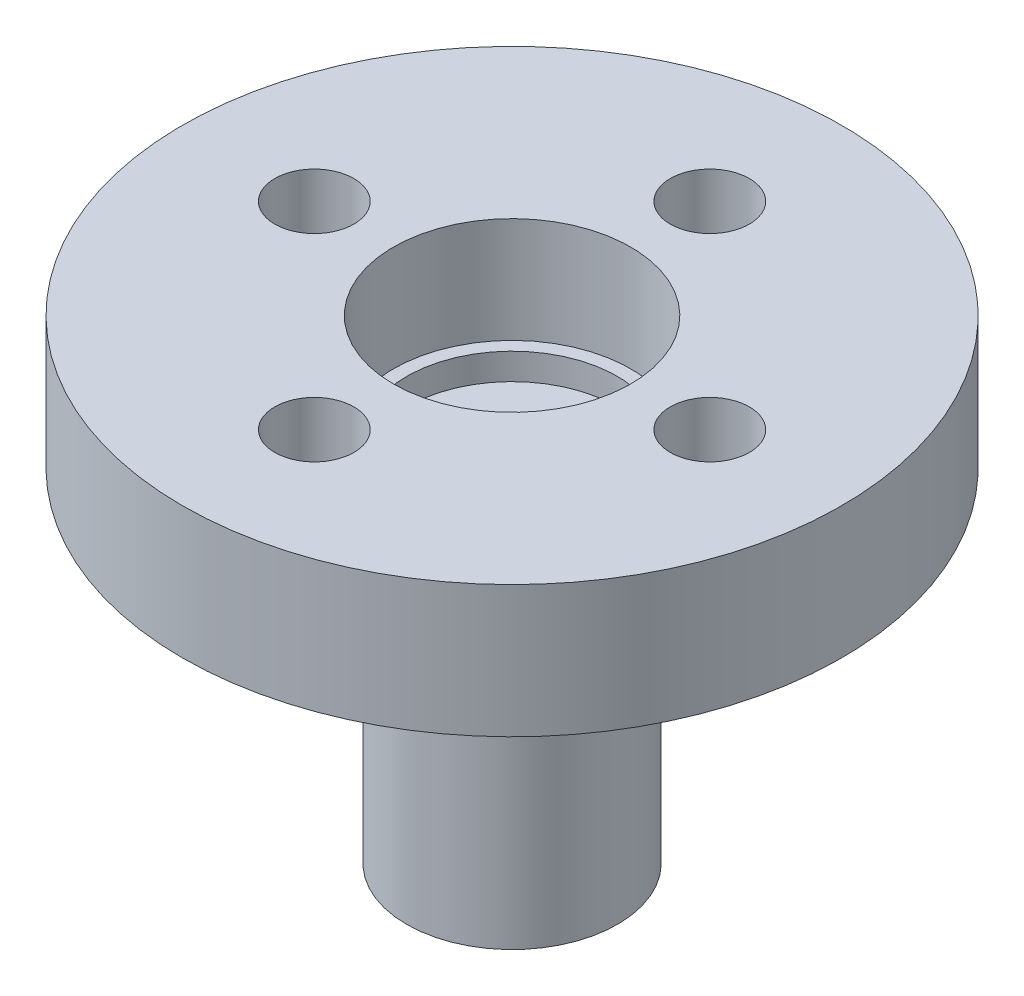
ISO-10303-21;
HEADER;
FILE_DESCRIPTION(('STEP AP214'),'2;1');
FILE_NAME('part.step','',(''),(''),'','','');
FILE_SCHEMA(('AUTOMOTIVE_DESIGN { 1 0 10303 214 1 1 1 1 }'));
ENDSEC;
DATA;
#1=APPLICATION_CONTEXT('core data for automotive mechanical design processes');
#2=APPLICATION_PROTOCOL_DEFINITION('international standard','automotive_design',2000,#1);
#3=PRODUCT_CONTEXT('',#1,'mechanical');
#4=PRODUCT('Part','Part','',(#3));
#5=PRODUCT_RELATED_PRODUCT_CATEGORY('part','',(#4));
#6=PRODUCT_DEFINITION_FORMATION('','',#4);
#7=PRODUCT_DEFINITION_CONTEXT('part definition',#1,'design');
#8=PRODUCT_DEFINITION('design','',#6,#7);
#9=PRODUCT_DEFINITION_SHAPE('','',#8);
#10=(LENGTH_UNIT() NAMED_UNIT(*) SI_UNIT(.MILLI.,.METRE.));
#11=(NAMED_UNIT(*) PLANE_ANGLE_UNIT() SI_UNIT($,.RADIAN.));
#12=(NAMED_UNIT(*) SI_UNIT($,.STERADIAN.) SOLID_ANGLE_UNIT());
#13=UNCERTAINTY_MEASURE_WITH_UNIT(LENGTH_MEASURE(1.E-05),#10,'distance_accuracy_value','');
#14=(GEOMETRIC_REPRESENTATION_CONTEXT(3) GLOBAL_UNCERTAINTY_ASSIGNED_CONTEXT((#13)) GLOBAL_UNIT_ASSIGNED_CONTEXT((#10,
#11,#12)) REPRESENTATION_CONTEXT('',''));
#15=CARTESIAN_POINT('',(0.,0.,0.));
#16=DIRECTION('',(0.,0.,1.));
#17=DIRECTION('',(1.,0.,0.));
#18=AXIS2_PLACEMENT_3D('',#15,#16,#17);
#19=CARTESIAN_POINT('',(-7.49999999999979,5.,2.1270357817835E-13));
#20=DIRECTION('',(0.,-1.,0.));
#21=DIRECTION('',(0.,0.,-1.));
#22=AXIS2_PLACEMENT_3D('',#19,#20,#21);
#23=CYLINDRICAL_SURFACE('',#22,1.50000000000034);
#24=CARTESIAN_POINT('',(-7.49999999999979,5.,2.1270357817835E-13));
#25=DIRECTION('',(0.,1.,0.));
#26=DIRECTION('',(0.,0.,1.));
#27=AXIS2_PLACEMENT_3D('',#24,#25,#26);
#28=CIRCLE('',#27,1.50000000000034);
#29=CARTESIAN_POINT('',(-7.49999999999979,5.,1.50000000000055));
#30=VERTEX_POINT('',#29);
#31=EDGE_CURVE('E46',#30,#30,#28,.T.);
#32=ORIENTED_EDGE('',*,*,#31,.T.);
#33=EDGE_LOOP('',(#32));
#34=FACE_BOUND('',#33,.T.);
#35=CARTESIAN_POINT('',(-7.49999999999979,0.,2.1270357817835E-13));
#36=DIRECTION('',(0.,1.,0.));
#37=DIRECTION('',(0.,0.,1.));
#38=AXIS2_PLACEMENT_3D('',#35,#36,#37);
#39=CIRCLE('',#38,1.50000000000034);
#40=CARTESIAN_POINT('',(-7.49999999999979,0.,1.50000000000055));
#41=VERTEX_POINT('',#40);
#42=EDGE_CURVE('E65',#41,#41,#39,.T.);
#43=ORIENTED_EDGE('',*,*,#42,.F.);
#44=EDGE_LOOP('',(#43));
#45=FACE_BOUND('',#44,.T.);
#46=ADVANCED_FACE('F35',(#34,#45),#23,.F.);
#47=CARTESIAN_POINT('',(4.23570186157979E-13,5.,7.5));
#48=DIRECTION('',(0.,-1.,0.));
#49=DIRECTION('',(0.,0.,-1.));
#50=AXIS2_PLACEMENT_3D('',#47,#48,#49);
#51=CYLINDRICAL_SURFACE('',#50,1.50000000000045);
#52=CARTESIAN_POINT('',(4.23570186157979E-13,5.,7.5));
#53=DIRECTION('',(0.,1.,0.));
#54=DIRECTION('',(0.,0.,1.));
#55=AXIS2_PLACEMENT_3D('',#52,#53,#54);
#56=CIRCLE('',#55,1.50000000000045);
#57=CARTESIAN_POINT('',(4.23570186157979E-13,5.,9.00000000000045));
#58=VERTEX_POINT('',#57);
#59=EDGE_CURVE('E51',#58,#58,#56,.T.);
#60=ORIENTED_EDGE('',*,*,#59,.T.);
#61=EDGE_LOOP('',(#60));
#62=FACE_BOUND('',#61,.T.);
#63=CARTESIAN_POINT('',(4.23570186157979E-13,0.,7.5));
#64=DIRECTION('',(0.,1.,0.));
#65=DIRECTION('',(0.,0.,1.));
#66=AXIS2_PLACEMENT_3D('',#63,#64,#65);
#67=CIRCLE('',#66,1.50000000000045);
#68=CARTESIAN_POINT('',(4.23570186157979E-13,0.,9.00000000000045));
#69=VERTEX_POINT('',#68);
#70=EDGE_CURVE('E62',#69,#69,#67,.T.);
#71=ORIENTED_EDGE('',*,*,#70,.F.);
#72=EDGE_LOOP('',(#71));
#73=FACE_BOUND('',#72,.T.);
#74=ADVANCED_FACE('F87',(#62,#73),#51,.F.);
#75=CARTESIAN_POINT('',(7.50000000000021,5.,-2.11785093078989E-13));
#76=DIRECTION('',(0.,-1.,0.));
#77=DIRECTION('',(0.,0.,-1.));
#78=AXIS2_PLACEMENT_3D('',#75,#76,#77);
#79=CYLINDRICAL_SURFACE('',#78,1.50000000000017);
#80=CARTESIAN_POINT('',(7.50000000000021,5.,-2.11785093078989E-13));
#81=DIRECTION('',(0.,1.,0.));
#82=DIRECTION('',(0.,0.,1.));
#83=AXIS2_PLACEMENT_3D('',#80,#81,#82);
#84=CIRCLE('',#83,1.50000000000017);
#85=CARTESIAN_POINT('',(7.50000000000021,5.,1.49999999999995));
#86=VERTEX_POINT('',#85);
#87=EDGE_CURVE('E78',#86,#86,#84,.T.);
#88=ORIENTED_EDGE('',*,*,#87,.T.);
#89=EDGE_LOOP('',(#88));
#90=FACE_BOUND('',#89,.T.);
#91=CARTESIAN_POINT('',(7.50000000000021,0.,-2.11785093078989E-13));
#92=DIRECTION('',(0.,1.,0.));
#93=DIRECTION('',(0.,0.,1.));
#94=AXIS2_PLACEMENT_3D('',#91,#92,#93);
#95=CIRCLE('',#94,1.50000000000017);
#96=CARTESIAN_POINT('',(7.50000000000021,0.,1.49999999999995));
#97=VERTEX_POINT('',#96);
#98=EDGE_CURVE('E58',#97,#97,#95,.T.);
#99=ORIENTED_EDGE('',*,*,#98,.F.);
#100=EDGE_LOOP('',(#99));
#101=FACE_BOUND('',#100,.T.);
#102=ADVANCED_FACE('F124',(#90,#101),#79,.F.);
#103=CARTESIAN_POINT('',(0.,5.,-7.5));
#104=DIRECTION('',(0.,-1.,0.));
#105=DIRECTION('',(0.,0.,-1.));
#106=AXIS2_PLACEMENT_3D('',#103,#104,#105);
#107=CYLINDRICAL_SURFACE('',#106,1.5);
#108=CARTESIAN_POINT('',(0.,5.,-7.5));
#109=DIRECTION('',(0.,1.,0.));
#110=DIRECTION('',(0.,0.,1.));
#111=AXIS2_PLACEMENT_3D('',#108,#109,#110);
#112=CIRCLE('',#111,1.5);
#113=CARTESIAN_POINT('',(0.,5.,-6.));
#114=VERTEX_POINT('',#113);
#115=EDGE_CURVE('E73',#114,#114,#112,.T.);
#116=ORIENTED_EDGE('',*,*,#115,.T.);
#117=EDGE_LOOP('',(#116));
#118=FACE_BOUND('',#117,.T.);
#119=CARTESIAN_POINT('',(0.,0.,-7.5));
#120=DIRECTION('',(0.,1.,0.));
#121=DIRECTION('',(0.,0.,1.));
#122=AXIS2_PLACEMENT_3D('',#119,#120,#121);
#123=CIRCLE('',#122,1.5);
#124=CARTESIAN_POINT('',(0.,0.,-6.));
#125=VERTEX_POINT('',#124);
#126=EDGE_CURVE('E55',#125,#125,#123,.T.);
#127=ORIENTED_EDGE('',*,*,#126,.F.);
#128=EDGE_LOOP('',(#127));
#129=FACE_BOUND('',#128,.T.);
#130=ADVANCED_FACE('F126',(#118,#129),#107,.F.);
#131=CARTESIAN_POINT('',(0.,5.,0.));
#132=DIRECTION('',(0.,-1.,0.));
#133=DIRECTION('',(0.,0.,-1.));
#134=AXIS2_PLACEMENT_3D('',#131,#132,#133);
#135=CYLINDRICAL_SURFACE('',#134,4.5);
#136=CARTESIAN_POINT('',(0.,1.,0.));
#137=DIRECTION('',(0.,1.,0.));
#138=DIRECTION('',(0.,0.,1.));
#139=AXIS2_PLACEMENT_3D('',#136,#137,#138);
#140=CIRCLE('',#139,4.5);
#141=CARTESIAN_POINT('',(0.,1.,4.5));
#142=VERTEX_POINT('',#141);
#143=EDGE_CURVE('E10',#142,#142,#140,.T.);
#144=ORIENTED_EDGE('',*,*,#143,.F.);
#145=EDGE_LOOP('',(#144));
#146=FACE_BOUND('',#145,.T.);
#147=CARTESIAN_POINT('',(0.,5.,0.));
#148=DIRECTION('',(0.,1.,0.));
#149=DIRECTION('',(0.,0.,1.));
#150=AXIS2_PLACEMENT_3D('',#147,#148,#149);
#151=CIRCLE('',#150,4.5);
#152=CARTESIAN_POINT('',(0.,5.,4.5));
#153=VERTEX_POINT('',#152);
#154=EDGE_CURVE('E69',#153,#153,#151,.T.);
#155=ORIENTED_EDGE('',*,*,#154,.T.);
#156=EDGE_LOOP('',(#155));
#157=FACE_BOUND('',#156,.T.);
#158=ADVANCED_FACE('F37',(#146,#157),#135,.F.);
#159=CARTESIAN_POINT('',(0.,5.,0.));
#160=DIRECTION('',(0.,-1.,0.));
#161=DIRECTION('',(0.,0.,-1.));
#162=AXIS2_PLACEMENT_3D('',#159,#160,#161);
#163=CYLINDRICAL_SURFACE('',#162,12.5);
#164=CARTESIAN_POINT('',(0.,5.,0.));
#165=DIRECTION('',(0.,1.,0.));
#166=DIRECTION('',(0.,0.,1.));
#167=AXIS2_PLACEMENT_3D('',#164,#165,#166);
#168=CIRCLE('',#167,12.5);
#169=CARTESIAN_POINT('',(0.,5.,12.5));
#170=VERTEX_POINT('',#169);
#171=EDGE_CURVE('E42',#170,#170,#168,.T.);
#172=ORIENTED_EDGE('',*,*,#171,.F.);
#173=EDGE_LOOP('',(#172));
#174=FACE_BOUND('',#173,.T.);
#175=CARTESIAN_POINT('',(0.,0.,0.));
#176=DIRECTION('',(0.,1.,0.));
#177=DIRECTION('',(0.,0.,1.));
#178=AXIS2_PLACEMENT_3D('',#175,#176,#177);
#179=CIRCLE('',#178,12.5);
#180=CARTESIAN_POINT('',(0.,0.,12.5));
#181=VERTEX_POINT('',#180);
#182=EDGE_CURVE('E67',#181,#181,#179,.T.);
#183=ORIENTED_EDGE('',*,*,#182,.T.);
#184=EDGE_LOOP('',(#183));
#185=FACE_BOUND('',#184,.T.);
#186=ADVANCED_FACE('F94',(#174,#185),#163,.T.);
#187=CARTESIAN_POINT('',(0.,5.,0.));
#188=DIRECTION('',(0.,1.,0.));
#189=DIRECTION('',(0.,0.,1.));
#190=AXIS2_PLACEMENT_3D('',#187,#188,#189);
#191=PLANE('',#190);
#192=ORIENTED_EDGE('',*,*,#154,.F.);
#193=EDGE_LOOP('',(#192));
#194=FACE_BOUND('',#193,.T.);
#195=ORIENTED_EDGE('',*,*,#115,.F.);
#196=EDGE_LOOP('',(#195));
#197=FACE_BOUND('',#196,.T.);
#198=ORIENTED_EDGE('',*,*,#87,.F.);
#199=EDGE_LOOP('',(#198));
#200=FACE_BOUND('',#199,.T.);
#201=ORIENTED_EDGE('',*,*,#59,.F.);
#202=EDGE_LOOP('',(#201));
#203=FACE_BOUND('',#202,.T.);
#204=ORIENTED_EDGE('',*,*,#31,.F.);
#205=EDGE_LOOP('',(#204));
#206=FACE_BOUND('',#205,.T.);
#207=ORIENTED_EDGE('',*,*,#171,.T.);
#208=EDGE_LOOP('',(#207));
#209=FACE_BOUND('',#208,.T.);
#210=ADVANCED_FACE('F90',(#194,#197,#200,#203,#206,#209),#191,.T.);
#211=CARTESIAN_POINT('',(0.,0.,0.));
#212=DIRECTION('',(0.,1.,0.));
#213=DIRECTION('',(0.,0.,1.));
#214=AXIS2_PLACEMENT_3D('',#211,#212,#213);
#215=PLANE('',#214);
#216=CARTESIAN_POINT('',(0.,0.,0.));
#217=DIRECTION('',(0.,1.,0.));
#218=DIRECTION('',(0.,0.,1.));
#219=AXIS2_PLACEMENT_3D('',#216,#217,#218);
#220=CIRCLE('',#219,4.5);
#221=CARTESIAN_POINT('',(0.,0.,4.5));
#222=VERTEX_POINT('',#221);
#223=EDGE_CURVE('E59',#222,#222,#220,.T.);
#224=ORIENTED_EDGE('',*,*,#223,.T.);
#225=EDGE_LOOP('',(#224));
#226=FACE_BOUND('',#225,.T.);
#227=ORIENTED_EDGE('',*,*,#126,.T.);
#228=EDGE_LOOP('',(#227));
#229=FACE_BOUND('',#228,.T.);
#230=ORIENTED_EDGE('',*,*,#98,.T.);
#231=EDGE_LOOP('',(#230));
#232=FACE_BOUND('',#231,.T.);
#233=ORIENTED_EDGE('',*,*,#70,.T.);
#234=EDGE_LOOP('',(#233));
#235=FACE_BOUND('',#234,.T.);
#236=ORIENTED_EDGE('',*,*,#42,.T.);
#237=EDGE_LOOP('',(#236));
#238=FACE_BOUND('',#237,.T.);
#239=ORIENTED_EDGE('',*,*,#182,.F.);
#240=EDGE_LOOP('',(#239));
#241=FACE_BOUND('',#240,.T.);
#242=ADVANCED_FACE('F93',(#226,#229,#232,#235,#238,#241),#215,.F.);
#243=CARTESIAN_POINT('',(0.,-1.,0.));
#244=DIRECTION('',(0.,1.,0.));
#245=DIRECTION('',(0.,0.,1.));
#246=AXIS2_PLACEMENT_3D('',#243,#244,#245);
#247=CYLINDRICAL_SURFACE('',#246,4.5);
#248=CARTESIAN_POINT('',(0.,-1.,0.));
#249=DIRECTION('',(0.,1.,0.));
#250=DIRECTION('',(0.,0.,1.));
#251=AXIS2_PLACEMENT_3D('',#248,#249,#250);
#252=CIRCLE('',#251,4.5);
#253=CARTESIAN_POINT('',(0.,-1.,4.5));
#254=VERTEX_POINT('',#253);
#255=EDGE_CURVE('E231',#254,#254,#252,.T.);
#256=ORIENTED_EDGE('',*,*,#255,.T.);
#257=EDGE_LOOP('',(#256));
#258=FACE_BOUND('',#257,.T.);
#259=ORIENTED_EDGE('',*,*,#223,.F.);
#260=EDGE_LOOP('',(#259));
#261=FACE_BOUND('',#260,.T.);
#262=ADVANCED_FACE('F106',(#258,#261),#247,.T.);
#263=CARTESIAN_POINT('',(0.,-1.,0.));
#264=DIRECTION('',(0.,1.,0.));
#265=DIRECTION('',(0.,0.,1.));
#266=AXIS2_PLACEMENT_3D('',#263,#264,#265);
#267=CYLINDRICAL_SURFACE('',#266,4.);
#268=CARTESIAN_POINT('',(0.,0.,0.));
#269=DIRECTION('',(0.,1.,0.));
#270=DIRECTION('',(0.,0.,1.));
#271=AXIS2_PLACEMENT_3D('',#268,#269,#270);
#272=CIRCLE('',#271,4.);
#273=CARTESIAN_POINT('',(0.,0.,4.));
#274=VERTEX_POINT('',#273);
#275=EDGE_CURVE('E239',#274,#274,#272,.T.);
#276=ORIENTED_EDGE('',*,*,#275,.F.);
#277=EDGE_LOOP('',(#276));
#278=FACE_BOUND('',#277,.T.);
#279=CARTESIAN_POINT('',(0.,1.,0.));
#280=DIRECTION('',(0.,1.,0.));
#281=DIRECTION('',(0.,0.,1.));
#282=AXIS2_PLACEMENT_3D('',#279,#280,#281);
#283=CIRCLE('',#282,4.);
#284=CARTESIAN_POINT('',(0.,1.,4.));
#285=VERTEX_POINT('',#284);
#286=EDGE_CURVE('E229',#285,#285,#283,.T.);
#287=ORIENTED_EDGE('',*,*,#286,.T.);
#288=EDGE_LOOP('',(#287));
#289=FACE_BOUND('',#288,.T.);
#290=ADVANCED_FACE('F112',(#278,#289),#267,.F.);
#291=CARTESIAN_POINT('',(0.,-1.,0.));
#292=DIRECTION('',(0.,1.,0.));
#293=DIRECTION('',(0.,0.,1.));
#294=AXIS2_PLACEMENT_3D('',#291,#292,#293);
#295=PLANE('',#294);
#296=CARTESIAN_POINT('',(0.,-0.999999999999999,0.));
#297=DIRECTION('',(0.,1.,0.));
#298=DIRECTION('',(0.,0.,1.));
#299=AXIS2_PLACEMENT_3D('',#296,#297,#298);
#300=CIRCLE('',#299,4.);
#301=CARTESIAN_POINT('',(0.,-1.,4.));
#302=VERTEX_POINT('',#301);
#303=EDGE_CURVE('E232',#302,#302,#300,.T.);
#304=ORIENTED_EDGE('',*,*,#303,.T.);
#305=EDGE_LOOP('',(#304));
#306=FACE_BOUND('',#305,.T.);
#307=ORIENTED_EDGE('',*,*,#255,.F.);
#308=EDGE_LOOP('',(#307));
#309=FACE_BOUND('',#308,.T.);
#310=ADVANCED_FACE('F203',(#306,#309),#295,.F.);
#311=CARTESIAN_POINT('',(0.,1.,0.));
#312=DIRECTION('',(0.,1.,0.));
#313=DIRECTION('',(0.,0.,1.));
#314=AXIS2_PLACEMENT_3D('',#311,#312,#313);
#315=PLANE('',#314);
#316=ORIENTED_EDGE('',*,*,#286,.F.);
#317=EDGE_LOOP('',(#316));
#318=FACE_BOUND('',#317,.T.);
#319=ORIENTED_EDGE('',*,*,#143,.T.);
#320=EDGE_LOOP('',(#319));
#321=FACE_BOUND('',#320,.T.);
#322=ADVANCED_FACE('F182',(#318,#321),#315,.T.);
#323=CARTESIAN_POINT('',(0.,-13.,0.));
#324=DIRECTION('',(0.,1.,0.));
#325=DIRECTION('',(0.,0.,1.));
#326=AXIS2_PLACEMENT_3D('',#323,#324,#325);
#327=PLANE('',#326);
#328=CARTESIAN_POINT('',(0.,-13.,0.));
#329=DIRECTION('',(0.,1.,0.));
#330=DIRECTION('',(0.,0.,1.));
#331=AXIS2_PLACEMENT_3D('',#328,#329,#330);
#332=CIRCLE('',#331,4.);
#333=CARTESIAN_POINT('',(0.,-13.,4.));
#334=VERTEX_POINT('',#333);
#335=EDGE_CURVE('E236',#334,#334,#332,.T.);
#336=ORIENTED_EDGE('',*,*,#335,.F.);
#337=EDGE_LOOP('',(#336));
#338=FACE_BOUND('',#337,.T.);
#339=ADVANCED_FACE('F172',(#338),#327,.F.);
#340=CARTESIAN_POINT('',(0.,-13.,0.));
#341=DIRECTION('',(0.,1.,0.));
#342=DIRECTION('',(0.,0.,1.));
#343=AXIS2_PLACEMENT_3D('',#340,#341,#342);
#344=CYLINDRICAL_SURFACE('',#343,4.);
#345=CARTESIAN_POINT('',(0.,-13.,4.));
#346=CARTESIAN_POINT('',(0.,-12.875,4.));
#347=CARTESIAN_POINT('',(0.,-12.75,4.));
#348=CARTESIAN_POINT('',(0.,-12.5,4.));
#349=CARTESIAN_POINT('',(0.,-12.375,4.));
#350=CARTESIAN_POINT('',(0.,-12.125,4.));
#351=CARTESIAN_POINT('',(0.,-12.,4.));
#352=CARTESIAN_POINT('',(0.,-11.75,4.));
#353=CARTESIAN_POINT('',(0.,-11.625,4.));
#354=CARTESIAN_POINT('',(0.,-11.375,4.));
#355=CARTESIAN_POINT('',(0.,-11.25,4.));
#356=CARTESIAN_POINT('',(0.,-11.,4.));
#357=CARTESIAN_POINT('',(0.,-10.875,4.));
#358=CARTESIAN_POINT('',(0.,-10.625,4.));
#359=CARTESIAN_POINT('',(0.,-10.5,4.));
#360=CARTESIAN_POINT('',(0.,-10.25,4.));
#361=CARTESIAN_POINT('',(0.,-10.125,4.));
#362=CARTESIAN_POINT('',(0.,-9.875,4.));
#363=CARTESIAN_POINT('',(0.,-9.75,4.));
#364=CARTESIAN_POINT('',(0.,-9.5,4.));
#365=CARTESIAN_POINT('',(0.,-9.375,4.));
#366=CARTESIAN_POINT('',(0.,-9.125,4.));
#367=CARTESIAN_POINT('',(0.,-9.,4.));
#368=CARTESIAN_POINT('',(0.,-8.75,4.));
#369=CARTESIAN_POINT('',(0.,-8.625,4.));
#370=CARTESIAN_POINT('',(0.,-8.375,4.));
#371=CARTESIAN_POINT('',(0.,-8.25,4.));
#372=CARTESIAN_POINT('',(0.,-8.,4.));
#373=CARTESIAN_POINT('',(0.,-7.875,4.));
#374=CARTESIAN_POINT('',(0.,-7.625,4.));
#375=CARTESIAN_POINT('',(0.,-7.5,4.));
#376=CARTESIAN_POINT('',(0.,-7.25,4.));
#377=CARTESIAN_POINT('',(0.,-7.125,4.));
#378=CARTESIAN_POINT('',(0.,-6.875,4.));
#379=CARTESIAN_POINT('',(0.,-6.75,4.));
#380=CARTESIAN_POINT('',(0.,-6.5,4.));
#381=CARTESIAN_POINT('',(0.,-6.375,4.));
#382=CARTESIAN_POINT('',(0.,-6.125,4.));
#383=CARTESIAN_POINT('',(0.,-6.,4.));
#384=CARTESIAN_POINT('',(0.,-5.75,4.));
#385=CARTESIAN_POINT('',(0.,-5.625,4.));
#386=CARTESIAN_POINT('',(0.,-5.375,4.));
#387=CARTESIAN_POINT('',(0.,-5.25,4.));
#388=CARTESIAN_POINT('',(0.,-5.,4.));
#389=CARTESIAN_POINT('',(0.,-4.875,4.));
#390=CARTESIAN_POINT('',(0.,-4.625,4.));
#391=CARTESIAN_POINT('',(0.,-4.5,4.));
#392=CARTESIAN_POINT('',(0.,-4.25,4.));
#393=CARTESIAN_POINT('',(0.,-4.125,4.));
#394=CARTESIAN_POINT('',(0.,-3.875,4.));
#395=CARTESIAN_POINT('',(0.,-3.75,4.));
#396=CARTESIAN_POINT('',(0.,-3.5,4.));
#397=CARTESIAN_POINT('',(0.,-3.375,4.));
#398=CARTESIAN_POINT('',(0.,-3.125,4.));
#399=CARTESIAN_POINT('',(0.,-3.,4.));
#400=CARTESIAN_POINT('',(0.,-2.75,4.));
#401=CARTESIAN_POINT('',(0.,-2.625,4.));
#402=CARTESIAN_POINT('',(0.,-2.375,4.));
#403=CARTESIAN_POINT('',(0.,-2.25,4.));
#404=CARTESIAN_POINT('',(0.,-2.,4.));
#405=CARTESIAN_POINT('',(0.,-1.875,4.));
#406=CARTESIAN_POINT('',(0.,-1.625,4.));
#407=CARTESIAN_POINT('',(0.,-1.5,4.));
#408=CARTESIAN_POINT('',(0.,-1.25,4.));
#409=CARTESIAN_POINT('',(0.,-1.125,4.));
#410=CARTESIAN_POINT('',(0.,-1.,4.));
#411=B_SPLINE_CURVE_WITH_KNOTS('',3,(#345,#346,#347,#348,#349,#350,#351,#352,#353,#354,#355,
#356,#357,#358,#359,#360,#361,#362,#363,#364,#365,#366,#367,#368,#369,#370,#371,#372,#373,#374,
#375,#376,#377,#378,#379,#380,#381,#382,#383,#384,#385,#386,#387,#388,#389,#390,#391,#392,#393,
#394,#395,#396,#397,#398,#399,#400,#401,#402,#403,#404,#405,#406,#407,#408,#409,#410),
.UNSPECIFIED.,.F.,.F.,(4,2,2,2,2,2,2,2,2,2,2,2,2,2,2,2,2,2,2,2,2,2,2,2,2,2,2,2,2,2,2,2,4),(0.,
0.374999999999999,0.749999999999999,1.125,1.5,1.875,2.25,2.625,3.,3.375,3.75,4.125,4.5,4.875,
5.25,5.625,6.,6.375,6.75,7.125,7.5,7.875,8.25,8.625,9.,9.375,9.75,10.125,10.5,10.875,11.25,
11.625,12.),.UNSPECIFIED.);
#412=EDGE_CURVE('BSEAM165',#334,#302,#411,.T.);
#413=ORIENTED_EDGE('',*,*,#335,.T.);
#414=ORIENTED_EDGE('',*,*,#303,.F.);
#415=ORIENTED_EDGE('',*,*,#412,.T.);
#416=ORIENTED_EDGE('',*,*,#412,.F.);
#417=EDGE_LOOP('',(#413,#415,#414,#416));
#418=FACE_BOUND('',#417,.T.);
#419=ADVANCED_FACE('F165',(#418),#344,.T.);
#420=CARTESIAN_POINT('',(0.,0.,0.));
#421=DIRECTION('',(0.,1.,0.));
#422=DIRECTION('',(0.,0.,1.));
#423=AXIS2_PLACEMENT_3D('',#420,#421,#422);
#424=PLANE('',#423);
#425=ORIENTED_EDGE('',*,*,#275,.T.);
#426=EDGE_LOOP('',(#425));
#427=FACE_BOUND('',#426,.T.);
#428=ADVANCED_FACE('F171',(#427),#424,.T.);
#429=CLOSED_SHELL('',(#46,#74,#102,#130,#158,#186,#210,#242,#262,#290,#310,#322,#339,#419,#428));
#430=MANIFOLD_SOLID_BREP('B2',#429);
#431=ADVANCED_BREP_SHAPE_REPRESENTATION('',(#18,#430),#14);
#432=SHAPE_DEFINITION_REPRESENTATION(#9,#431);
ENDSEC;
END-ISO-10303-21;
